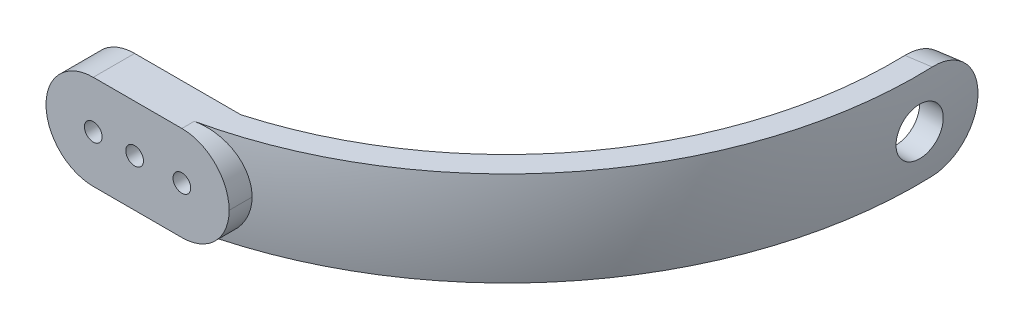
ISO-10303-21;
HEADER;
FILE_DESCRIPTION(('STEP AP214'),'2;1');
FILE_NAME('part.step','',(''),(''),'','','');
FILE_SCHEMA(('AUTOMOTIVE_DESIGN { 1 0 10303 214 1 1 1 1 }'));
ENDSEC;
DATA;
#1=APPLICATION_CONTEXT('core data for automotive mechanical design processes');
#2=APPLICATION_PROTOCOL_DEFINITION('international standard','automotive_design',2000,#1);
#3=PRODUCT_CONTEXT('',#1,'mechanical');
#4=PRODUCT('Part','Part','',(#3));
#5=PRODUCT_RELATED_PRODUCT_CATEGORY('part','',(#4));
#6=PRODUCT_DEFINITION_FORMATION('','',#4);
#7=PRODUCT_DEFINITION_CONTEXT('part definition',#1,'design');
#8=PRODUCT_DEFINITION('design','',#6,#7);
#9=PRODUCT_DEFINITION_SHAPE('','',#8);
#10=(LENGTH_UNIT() NAMED_UNIT(*) SI_UNIT(.MILLI.,.METRE.));
#11=(NAMED_UNIT(*) PLANE_ANGLE_UNIT() SI_UNIT($,.RADIAN.));
#12=(NAMED_UNIT(*) SI_UNIT($,.STERADIAN.) SOLID_ANGLE_UNIT());
#13=UNCERTAINTY_MEASURE_WITH_UNIT(LENGTH_MEASURE(1.E-05),#10,'distance_accuracy_value','');
#14=(GEOMETRIC_REPRESENTATION_CONTEXT(3) GLOBAL_UNCERTAINTY_ASSIGNED_CONTEXT((#13)) GLOBAL_UNIT_ASSIGNED_CONTEXT((#10,
#11,#12)) REPRESENTATION_CONTEXT('',''));
#15=CARTESIAN_POINT('',(0.,0.,0.));
#16=DIRECTION('',(0.,0.,1.));
#17=DIRECTION('',(1.,0.,0.));
#18=AXIS2_PLACEMENT_3D('',#15,#16,#17);
#19=CARTESIAN_POINT('',(18.,-11.,70.));
#20=DIRECTION('',(-1.,0.,0.));
#21=DIRECTION('',(0.,0.,1.));
#22=AXIS2_PLACEMENT_3D('',#19,#20,#21);
#23=PLANE('',#22);
#24=DIRECTION('',(0.,-1.,0.));
#25=VECTOR('',#24,1.);
#26=CARTESIAN_POINT('',(18.,-11.,63.));
#27=LINE('',#26,#25);
#28=CARTESIAN_POINT('',(18.,8.,63.));
#29=VERTEX_POINT('',#28);
#30=CARTESIAN_POINT('',(18.,7.93725393319381,63.));
#31=VERTEX_POINT('',#30);
#32=EDGE_CURVE('E156',#29,#31,#27,.T.);
#33=ORIENTED_EDGE('',*,*,#32,.F.);
#34=DIRECTION('',(0.,0.,-1.));
#35=VECTOR('',#34,1.);
#36=CARTESIAN_POINT('',(18.,8.,64.7628050569257));
#37=LINE('',#36,#35);
#38=CARTESIAN_POINT('',(18.,8.,62.9920629920945));
#39=VERTEX_POINT('',#38);
#40=EDGE_CURVE('E269',#29,#39,#37,.T.);
#41=ORIENTED_EDGE('',*,*,#40,.T.);
#42=CARTESIAN_POINT('',(18.,0.,0.));
#43=DIRECTION('',(-1.,0.,0.));
#44=DIRECTION('',(0.,0.,1.));
#45=AXIS2_PLACEMENT_3D('',#42,#43,#44);
#46=CIRCLE('',#45,63.4980314655502);
#47=EDGE_CURVE('E428',#39,#31,#46,.F.);
#48=ORIENTED_EDGE('',*,*,#47,.T.);
#49=EDGE_LOOP('',(#33,#41,#48));
#50=FACE_BOUND('',#49,.T.);
#51=ADVANCED_FACE('F38',(#50),#23,.T.);
#52=CARTESIAN_POINT('',(0.,0.,0.));
#53=DIRECTION('',(0.,1.,0.));
#54=DIRECTION('',(-0.15093609829513,0.,0.988543521667834));
#55=AXIS2_PLACEMENT_3D('',#52,#53,#54);
#56=SPHERICAL_SURFACE('',#55,70.);
#57=CARTESIAN_POINT('',(69.8856208386246,0.,0.));
#58=DIRECTION('',(-1.,0.,0.));
#59=DIRECTION('',(0.,0.,1.));
#60=AXIS2_PLACEMENT_3D('',#57,#58,#59);
#61=CIRCLE('',#60,4.);
#62=CARTESIAN_POINT('',(69.8856208386246,0.,4.));
#63=VERTEX_POINT('',#62);
#64=EDGE_CURVE('E260',#63,#63,#61,.F.);
#65=ORIENTED_EDGE('',*,*,#64,.F.);
#66=EDGE_LOOP('',(#65));
#67=FACE_BOUND('',#66,.T.);
#68=CARTESIAN_POINT('',(0.,-8.,0.));
#69=DIRECTION('',(0.,1.,0.));
#70=DIRECTION('',(0.,0.,1.));
#71=AXIS2_PLACEMENT_3D('',#68,#69,#70);
#72=CIRCLE('',#71,69.5413546028548);
#73=CARTESIAN_POINT('',(15.,-8.,67.9043444854598));
#74=VERTEX_POINT('',#73);
#75=CARTESIAN_POINT('',(69.4957432674389,-8.,-2.51826680600461));
#76=VERTEX_POINT('',#75);
#77=EDGE_CURVE('E262',#74,#76,#72,.T.);
#78=ORIENTED_EDGE('',*,*,#77,.T.);
#79=CARTESIAN_POINT('',(69.4957432674389,-8.,-2.51826680600461));
#80=CARTESIAN_POINT('',(69.4875017131773,-8.00002341088787,-2.74571022100777));
#81=CARTESIAN_POINT('',(69.4792451961191,-7.99041729842394,-2.97315022801403));
#82=CARTESIAN_POINT('',(69.4627618438289,-7.95211387095649,-3.42641067374961));
#83=CARTESIAN_POINT('',(69.454535007599,-7.92341720391869,-3.65223116718501));
#84=CARTESIAN_POINT('',(69.4381746620994,-7.84712196636212,-4.10052930067805));
#85=CARTESIAN_POINT('',(69.43004110291,-7.79953404317318,-4.32300875060695));
#86=CARTESIAN_POINT('',(69.4139221562662,-7.68578819540183,-4.76317095642592));
#87=CARTESIAN_POINT('',(69.4059367665958,-7.61963054877588,-4.98085378406049));
#88=CARTESIAN_POINT('',(69.3901687417773,-7.46915353972273,-5.40999269046236));
#89=CARTESIAN_POINT('',(69.3823862211648,-7.38482415662114,-5.62144526017022));
#90=CARTESIAN_POINT('',(69.3670867983283,-7.19860403533245,-6.03648590257849));
#91=CARTESIAN_POINT('',(69.3595699007931,-7.09671298732663,-6.2400738364553));
#92=CARTESIAN_POINT('',(69.3448607511406,-6.87610069542728,-6.63786836378274));
#93=CARTESIAN_POINT('',(69.3376684242268,-6.75738335548599,-6.83207711936929));
#94=CARTESIAN_POINT('',(69.3236620342563,-6.50392732566858,-7.209755898544));
#95=CARTESIAN_POINT('',(69.3168479680533,-6.36918876907945,-7.39322601145231));
#96=CARTESIAN_POINT('',(69.3036715056989,-6.08506983708116,-7.747547544861));
#97=CARTESIAN_POINT('',(69.2973077882913,-5.9357356385859,-7.9184359433393));
#98=CARTESIAN_POINT('',(69.2850591763619,-5.623127954664,-8.24696658545992));
#99=CARTESIAN_POINT('',(69.279174279028,-5.45985455110906,-8.40460890689207));
#100=CARTESIAN_POINT('',(69.2679289700822,-5.12048516489429,-8.7055223848724));
#101=CARTESIAN_POINT('',(69.2625686649089,-4.94438659262226,-8.84879062509506));
#102=CARTESIAN_POINT('',(69.2524171642138,-4.58065066029969,-9.11985890931045));
#103=CARTESIAN_POINT('',(69.2476259568048,-4.39301354138502,-9.24765927638969));
#104=CARTESIAN_POINT('',(69.2386785777475,-4.00870050323243,-9.48612462730155));
#105=CARTESIAN_POINT('',(69.2345187553523,-3.81208582632338,-9.59688817423157));
#106=CARTESIAN_POINT('',(69.2268336563934,-3.41018259287138,-9.80137791333396));
#107=CARTESIAN_POINT('',(69.2233083648441,-3.20489424131619,-9.89510450786889));
#108=CARTESIAN_POINT('',(69.2169227719366,-2.78720866014903,-10.0647829076265));
#109=CARTESIAN_POINT('',(69.2140621148858,-2.57481530287342,-10.1407442204416));
#110=CARTESIAN_POINT('',(69.2090276733347,-2.14443038685262,-10.2743711011757));
#111=CARTESIAN_POINT('',(69.2068537117056,-1.92644028746473,-10.3320413871665));
#112=CARTESIAN_POINT('',(69.2027123119848,-1.42621101601336,-10.4418725915661));
#113=CARTESIAN_POINT('',(69.2009629066603,-1.14266384447631,-10.4882412030183));
#114=CARTESIAN_POINT('',(69.1992133951032,-0.715176496997681,-10.5346070220113));
#115=CARTESIAN_POINT('',(69.1987759911827,-0.572394442625608,-10.5461977675899));
#116=CARTESIAN_POINT('',(69.1981925736217,-0.286419278335483,-10.5616569569071));
#117=CARTESIAN_POINT('',(69.1980465456946,-0.143226188915702,-10.56552577926));
#118=CARTESIAN_POINT('',(69.1980465167484,0.,-10.5655268806588));
#119=B_SPLINE_CURVE_WITH_KNOTS('',3,(#79,#80,#81,#82,#83,#84,#85,#86,#87,#88,#89,#90,#91,#92,
#93,#94,#95,#96,#97,#98,#99,#100,#101,#102,#103,#104,#105,#106,#107,#108,#109,#110,#111,#112,
#113,#114,#115,#116,#117,#118),.UNSPECIFIED.,.F.,.F.,(4,2,2,2,2,2,2,2,2,2,2,2,2,2,2,2,2,2,2,4),
(0.,0.682571489050463,1.36511981165193,2.04728398707933,2.72943795223981,3.41196905340096,
4.09451219684575,4.77689723848464,5.45927660348346,6.13956297691261,6.81984535496558,
7.5002654760771,8.18067138240227,8.85697951641801,9.53327167595491,10.2092010661415,
10.8849559619135,11.7450117926331,12.1745930697614,12.6041532835312),.UNSPECIFIED.);
#120=CARTESIAN_POINT('',(69.1980465167484,0.,-10.5655268806588));
#121=VERTEX_POINT('',#120);
#122=EDGE_CURVE('E180',#76,#121,#119,.T.);
#123=ORIENTED_EDGE('',*,*,#122,.T.);
#124=CARTESIAN_POINT('',(69.1980465167484,0.,-10.5655268806588));
#125=CARTESIAN_POINT('',(69.1980454665854,0.223947349429619,-10.5655519530303));
#126=CARTESIAN_POINT('',(69.1984034306223,0.447890695833986,-10.5560698861715));
#127=CARTESIAN_POINT('',(69.1998297882943,0.894167069433206,-10.5182728785933));
#128=CARTESIAN_POINT('',(69.2008981387781,1.11650019360936,-10.4899590817786));
#129=CARTESIAN_POINT('',(69.2037363433769,1.55777479057265,-10.4147152080081));
#130=CARTESIAN_POINT('',(69.2055055399614,1.77671924310613,-10.3678025803559));
#131=CARTESIAN_POINT('',(69.2097306228365,2.20987282548712,-10.2557151044174));
#132=CARTESIAN_POINT('',(69.2121865024183,2.42408200157534,-10.1905404345477));
#133=CARTESIAN_POINT('',(69.2177661925202,2.84633701563722,-10.0423753283899));
#134=CARTESIAN_POINT('',(69.2208902765638,3.05438028982769,-9.95937759633485));
#135=CARTESIAN_POINT('',(69.2277805149374,3.46274753133228,-9.77618930816188));
#136=CARTESIAN_POINT('',(69.2315466817563,3.66307134840357,-9.67599841762239));
#137=CARTESIAN_POINT('',(69.2396902095121,4.05456147171132,-9.45917070776137));
#138=CARTESIAN_POINT('',(69.2440674858784,4.24572904016114,-9.34253616403391));
#139=CARTESIAN_POINT('',(69.2533987341467,4.61760089386994,-9.09365739958339));
#140=CARTESIAN_POINT('',(69.2583527044525,4.79830520808605,-8.96141322206315));
#141=CARTESIAN_POINT('',(69.2688121658212,5.14846210115382,-8.68189750614859));
#142=CARTESIAN_POINT('',(69.2743190868676,5.31788351851896,-8.53458698548188));
#143=CARTESIAN_POINT('',(69.2858320949033,5.64382591204606,-8.22624327010059));
#144=CARTESIAN_POINT('',(69.2918383433573,5.80034268246081,-8.06520563609497));
#145=CARTESIAN_POINT('',(69.3043020954338,6.0993416497677,-7.73059660131886));
#146=CARTESIAN_POINT('',(69.3107596148327,6.24182335557913,-7.55702476235007));
#147=CARTESIAN_POINT('',(69.3240762701585,6.51177178276996,-7.1985873971491));
#148=CARTESIAN_POINT('',(69.330935409192,6.63923838798169,-7.01372178355692));
#149=CARTESIAN_POINT('',(69.3450490423056,6.87906426497763,-6.63277343977008));
#150=CARTESIAN_POINT('',(69.3523058101003,6.9913202980599,-6.4366257900794));
#151=CARTESIAN_POINT('',(69.3671161500053,7.19893989695086,-6.03568300426128));
#152=CARTESIAN_POINT('',(69.3746696221904,7.29430909137596,-5.83089077778256));
#153=CARTESIAN_POINT('',(69.3900180757666,7.46753509014453,-5.41408163024053));
#154=CARTESIAN_POINT('',(69.3978130039499,7.54539572191819,-5.20206629986378));
#155=CARTESIAN_POINT('',(69.4135852747677,7.68308590386594,-4.77235374693561));
#156=CARTESIAN_POINT('',(69.421562576273,7.74291947721329,-4.55465780395194));
#157=CARTESIAN_POINT('',(69.4404981442556,7.86212536279592,-4.0370243506344));
#158=CARTESIAN_POINT('',(69.4515114652535,7.913827880283,-3.73526822285095));
#159=CARTESIAN_POINT('',(69.4680844138113,7.9655258306655,-3.28009406649817));
#160=CARTESIAN_POINT('',(69.4736148382899,7.9784491663695,-3.12802106580806));
#161=CARTESIAN_POINT('',(69.484679679444,7.99568495680472,-2.82340092784478));
#162=CARTESIAN_POINT('',(69.4902140957397,7.9999981440219,-2.67085383200995));
#163=CARTESIAN_POINT('',(69.4957432674389,8.,-2.51826680600461));
#164=B_SPLINE_CURVE_WITH_KNOTS('',3,(#124,#125,#126,#127,#128,#129,#130,#131,#132,#133,#134,
#135,#136,#137,#138,#139,#140,#141,#142,#143,#144,#145,#146,#147,#148,#149,#150,#151,#152,#153,
#154,#155,#156,#157,#158,#159,#160,#161,#162,#163),.UNSPECIFIED.,.F.,.F.,(4,2,2,2,2,2,2,2,2,2,2,
2,2,2,2,2,2,2,2,4),(0.,0.671635368372018,1.34322994300633,2.01419591735426,2.68515533671865,
3.35638993475575,4.02763759035662,4.69879244476894,5.3699454416675,6.04288113790545,
6.71603529042563,7.38921298795271,8.06239589332727,8.73994065468902,9.41725915416632,
10.0944294453107,10.7714484974216,11.6882651247465,12.1462254015622,12.6041467169396),.UNSPECIFIED.);
#165=CARTESIAN_POINT('',(69.4957432674389,8.,-2.51826680600461));
#166=VERTEX_POINT('',#165);
#167=EDGE_CURVE('E171',#121,#166,#164,.T.);
#168=ORIENTED_EDGE('',*,*,#167,.T.);
#169=CARTESIAN_POINT('',(0.,8.,0.));
#170=DIRECTION('',(0.,1.,0.));
#171=DIRECTION('',(0.,0.,1.));
#172=AXIS2_PLACEMENT_3D('',#169,#170,#171);
#173=CIRCLE('',#172,69.5413546028548);
#174=CARTESIAN_POINT('',(15.,8.,67.9043444854598));
#175=VERTEX_POINT('',#174);
#176=EDGE_CURVE('E149',#175,#166,#173,.T.);
#177=ORIENTED_EDGE('',*,*,#176,.F.);
#178=CARTESIAN_POINT('',(15.,8.,67.9043444854598));
#179=CARTESIAN_POINT('',(15.2292062725426,8.00002124707828,67.8537136287984));
#180=CARTESIAN_POINT('',(15.4583983663156,7.99015045861157,67.8030281497459));
#181=CARTESIAN_POINT('',(15.9151453167856,7.95078357147516,67.7019067386223));
#182=CARTESIAN_POINT('',(16.1427001821122,7.92128757632186,67.6514708052363));
#183=CARTESIAN_POINT('',(16.594548929824,7.84283204057458,67.5512105782443));
#184=CARTESIAN_POINT('',(16.818843060833,7.79387399207213,67.5013862380514));
#185=CARTESIAN_POINT('',(17.2625900554091,7.67680484623127,67.4027056681577));
#186=CARTESIAN_POINT('',(17.4820430147384,7.60869412811482,67.3538494193093));
#187=CARTESIAN_POINT('',(17.9146895937432,7.45368540438562,67.2574281301334));
#188=CARTESIAN_POINT('',(18.1278786421793,7.36677404725622,67.2098640346053));
#189=CARTESIAN_POINT('',(18.5462792597172,7.17473950190849,67.1164197891441));
#190=CARTESIAN_POINT('',(18.7514907588961,7.06961615410688,67.0705396539712));
#191=CARTESIAN_POINT('',(19.1523403762765,6.8418702292022,66.9808315881375));
#192=CARTESIAN_POINT('',(19.3479817243004,6.71925361137289,66.9370029653319));
#193=CARTESIAN_POINT('',(19.7282793814668,6.45729693647524,66.8517272538304));
#194=CARTESIAN_POINT('',(19.9129358678915,6.31795714940773,66.8102801267005));
#195=CARTESIAN_POINT('',(20.2679141946846,6.02506914781207,66.7305338457381));
#196=CARTESIAN_POINT('',(20.4383687500698,5.87168970485998,66.6922056503031));
#197=CARTESIAN_POINT('',(20.7657989998587,5.55050907784231,66.6185213562539));
#198=CARTESIAN_POINT('',(20.9227750010497,5.38270822219861,66.5831651899932));
#199=CARTESIAN_POINT('',(21.222027814741,5.0338058092508,66.5157147116921));
#200=CARTESIAN_POINT('',(21.3643018455104,4.85270174592253,66.4836210169561));
#201=CARTESIAN_POINT('',(21.6329491795917,4.47850748925774,66.4229812964602));
#202=CARTESIAN_POINT('',(21.7593230840022,4.28541774944782,66.3944351365875));
#203=CARTESIAN_POINT('',(21.9924020654914,3.89321805110493,66.3417562031847));
#204=CARTESIAN_POINT('',(22.0994927960646,3.69434883359788,66.3175369953309));
#205=CARTESIAN_POINT('',(22.2966137934148,3.28792264955067,66.2729362847887));
#206=CARTESIAN_POINT('',(22.3866448145402,3.08036606764508,66.2525546124121));
#207=CARTESIAN_POINT('',(22.5488395035726,2.65821461273919,66.2158225230867));
#208=CARTESIAN_POINT('',(22.6210166971893,2.44362520811223,66.1994690544897));
#209=CARTESIAN_POINT('',(22.7469607662079,2.00893233517514,66.1709254912831));
#210=CARTESIAN_POINT('',(22.8007333539046,1.78883060054666,66.1587341048781));
#211=CARTESIAN_POINT('',(22.896558030183,1.30896644037356,66.1370047541603));
#212=CARTESIAN_POINT('',(22.9353473081042,1.04850458278868,66.1282059185894));
#213=CARTESIAN_POINT('',(22.9741342443534,0.656096847579059,66.1194069835085));
#214=CARTESIAN_POINT('',(22.9838303821287,0.525082467293003,66.1172072276797));
#215=CARTESIAN_POINT('',(22.99676305295,0.262720466776172,66.1142731160627));
#216=CARTESIAN_POINT('',(22.9999996630867,0.13137285054111,66.113538742786));
#217=CARTESIAN_POINT('',(23.,0.,66.1135387042624));
#218=B_SPLINE_CURVE_WITH_KNOTS('',3,(#178,#179,#180,#181,#182,#183,#184,#185,#186,#187,#188,
#189,#190,#191,#192,#193,#194,#195,#196,#197,#198,#199,#200,#201,#202,#203,#204,#205,#206,#207,
#208,#209,#210,#211,#212,#213,#214,#215,#216,#217),.UNSPECIFIED.,.F.,.F.,(4,2,2,2,2,2,2,2,2,2,2,
2,2,2,2,2,2,2,2,4),(0.,0.703985274037146,1.40796683481688,2.11189443405478,2.81580809654017,
3.52022330320237,4.22464468264261,4.92882666370941,5.63299727706607,6.329600981835,
7.0261888269025,7.72290823159178,8.41960128913236,9.10026425828163,9.78089712277246,
10.4610127629842,11.140917121762,11.9298634210277,12.323894453178,12.7179207827646),.UNSPECIFIED.);
#219=CARTESIAN_POINT('',(23.,0.,66.1135387042624));
#220=VERTEX_POINT('',#219);
#221=EDGE_CURVE('E11',#175,#220,#218,.T.);
#222=ORIENTED_EDGE('',*,*,#221,.T.);
#223=CARTESIAN_POINT('',(23.,0.,66.1135387042624));
#224=CARTESIAN_POINT('',(23.0000269880451,-0.220997502160253,66.1135321687056));
#225=CARTESIAN_POINT('',(22.9908436865702,-0.441989427328227,66.115616098668));
#226=CARTESIAN_POINT('',(22.9542526915268,-0.882360041920494,66.1239173905684));
#227=CARTESIAN_POINT('',(22.9268468008237,-1.10173888876523,66.1301343436027));
#228=CARTESIAN_POINT('',(22.8540596641734,-1.5370091390269,66.146642197528));
#229=CARTESIAN_POINT('',(22.8087045959354,-1.75290514680633,66.1569271654716));
#230=CARTESIAN_POINT('',(22.7003969576648,-2.18000331896746,66.1814796059804));
#231=CARTESIAN_POINT('',(22.6374444295899,-2.39120549453938,66.1957470690502));
#232=CARTESIAN_POINT('',(22.4944443976811,-2.80744245655006,66.22814303528));
#233=CARTESIAN_POINT('',(22.4143962874495,-3.0124770239231,66.2462716753998));
#234=CARTESIAN_POINT('',(22.2378100873343,-3.41503014116871,66.2862436463877));
#235=CARTESIAN_POINT('',(22.1412659367087,-3.6125458958545,66.3080883425434));
#236=CARTESIAN_POINT('',(21.932481894317,-3.99860526479969,66.3553019734689));
#237=CARTESIAN_POINT('',(21.8202451006609,-4.18715064020682,66.3806702125988));
#238=CARTESIAN_POINT('',(21.5809152272439,-4.55406791706324,66.4347294228986));
#239=CARTESIAN_POINT('',(21.4538215519938,-4.73243941029928,66.4634205272541));
#240=CARTESIAN_POINT('',(21.1842731025688,-5.0797249350459,66.5242267217534));
#241=CARTESIAN_POINT('',(21.0416663807282,-5.24851509922291,66.5563756382404));
#242=CARTESIAN_POINT('',(20.743310490832,-5.57342188714034,66.6235830181166));
#243=CARTESIAN_POINT('',(20.5875612312153,-5.72953842257145,66.6586415017761));
#244=CARTESIAN_POINT('',(20.2640217982758,-6.02814611802573,66.7314069213324));
#245=CARTESIAN_POINT('',(20.0962291067364,-6.17063441384435,66.7691144110867));
#246=CARTESIAN_POINT('',(19.7498280389245,-6.44107279352472,66.8468897623267));
#247=CARTESIAN_POINT('',(19.5712196143426,-6.56902281244259,66.8869576343552));
#248=CARTESIAN_POINT('',(19.2000829396511,-6.81246732572781,66.9701372380574));
#249=CARTESIAN_POINT('',(19.0073252489304,-6.92759521963085,67.013298574792));
#250=CARTESIAN_POINT('',(18.6132218883865,-7.14106716627811,67.1014551690303));
#251=CARTESIAN_POINT('',(18.4118789972992,-7.23941659886311,67.1464498329424));
#252=CARTESIAN_POINT('',(18.0019461247658,-7.41878408554253,67.2379632984776));
#253=CARTESIAN_POINT('',(17.79335631164,-7.49980254186154,67.2844820646998));
#254=CARTESIAN_POINT('',(17.370449846268,-7.64401157313948,67.3786963863018));
#255=CARTESIAN_POINT('',(17.1561342338867,-7.70720536147218,67.4263917278843));
#256=CARTESIAN_POINT('',(16.6223666230116,-7.84057898270197,67.5450513228949));
#257=CARTESIAN_POINT('',(16.3003384533434,-7.90035873007411,67.6165289972181));
#258=CARTESIAN_POINT('',(15.81422983832,-7.96013277617987,67.7242526674005));
#259=CARTESIAN_POINT('',(15.6517675455273,-7.97507484933947,67.7602263131144));
#260=CARTESIAN_POINT('',(15.3262219978427,-7.99500769407888,67.8322536678935));
#261=CARTESIAN_POINT('',(15.1631386417788,-7.99999676816249,67.8683073895662));
#262=CARTESIAN_POINT('',(15.,-8.,67.9043444854598));
#263=B_SPLINE_CURVE_WITH_KNOTS('',3,(#223,#224,#225,#226,#227,#228,#229,#230,#231,#232,#233,
#234,#235,#236,#237,#238,#239,#240,#241,#242,#243,#244,#245,#246,#247,#248,#249,#250,#251,#252,
#253,#254,#255,#256,#257,#258,#259,#260,#261,#262),.UNSPECIFIED.,.F.,.F.,(4,2,2,2,2,2,2,2,2,2,2,
2,2,2,2,2,2,2,2,4),(0.,0.662783709410763,1.32550185557689,1.98725701139818,2.64901058940825,
3.31078764439036,3.97280836502285,4.63469857070388,5.29661531517797,5.9657265437878,
6.63484243433628,7.30409864328793,7.97335784175278,8.65846172337293,9.34334551893059,
10.0282134176922,10.7129577716465,11.7159034743776,12.2168574573207,12.7178968712783),.UNSPECIFIED.);
#264=EDGE_CURVE('E48',#220,#74,#263,.T.);
#265=ORIENTED_EDGE('',*,*,#264,.T.);
#266=EDGE_LOOP('',(#78,#123,#168,#177,#222,#265));
#267=FACE_BOUND('',#266,.T.);
#268=ADVANCED_FACE('F190',(#67,#267),#56,.T.);
#269=CARTESIAN_POINT('',(0.,0.,0.));
#270=DIRECTION('',(0.,1.,0.));
#271=DIRECTION('',(-0.15093609829513,0.,0.988543521667834));
#272=AXIS2_PLACEMENT_3D('',#269,#270,#271);
#273=SPHERICAL_SURFACE('',#272,66.);
#274=CARTESIAN_POINT('',(65.8786763680024,0.,0.));
#275=DIRECTION('',(-1.,0.,0.));
#276=DIRECTION('',(0.,0.,1.));
#277=AXIS2_PLACEMENT_3D('',#274,#275,#276);
#278=CIRCLE('',#277,4.);
#279=CARTESIAN_POINT('',(65.8786763680024,0.,4.));
#280=VERTEX_POINT('',#279);
#281=EDGE_CURVE('E257',#280,#280,#278,.T.);
#282=ORIENTED_EDGE('',*,*,#281,.F.);
#283=EDGE_LOOP('',(#282));
#284=FACE_BOUND('',#283,.T.);
#285=CARTESIAN_POINT('',(65.4856261894513,8.,-1.90598073848083));
#286=CARTESIAN_POINT('',(65.4789954262735,8.00002331039559,-2.13380636503772));
#287=CARTESIAN_POINT('',(65.4723466680325,7.99040586848371,-2.36162869269555));
#288=CARTESIAN_POINT('',(65.4590615649028,7.95205630562121,-2.81565226137605));
#289=CARTESIAN_POINT('',(65.4524252196232,7.92332479719066,-3.04185355411084));
#290=CARTESIAN_POINT('',(65.4392164665826,7.84693444830008,-3.49091461906332));
#291=CARTESIAN_POINT('',(65.4326440263639,7.79928579247756,-3.7137761224706));
#292=CARTESIAN_POINT('',(65.4196082515972,7.68539154829748,-4.15469523181643));
#293=CARTESIAN_POINT('',(65.4131449153759,7.61914624544451,-4.37275291145015));
#294=CARTESIAN_POINT('',(65.4003723194107,7.46846441023645,-4.80263336844799));
#295=CARTESIAN_POINT('',(65.3940631484835,7.38401765464265,-5.01445256552379));
#296=CARTESIAN_POINT('',(65.3816509779747,7.19753197333295,-5.43021139144909));
#297=CARTESIAN_POINT('',(65.3755479819381,7.09549274531806,-5.63415088482454));
#298=CARTESIAN_POINT('',(65.3635973701703,6.87455245634856,-6.03262714797209));
#299=CARTESIAN_POINT('',(65.3577496940183,6.75565541335526,-6.22716614352601));
#300=CARTESIAN_POINT('',(65.3463546734433,6.50180679345797,-6.60547962172241));
#301=CARTESIAN_POINT('',(65.3408073264033,6.36685535647738,-6.78925419816224));
#302=CARTESIAN_POINT('',(65.330076416556,6.08233584219563,-7.14407924927708));
#303=CARTESIAN_POINT('',(65.3248916570049,5.93282016731223,-7.31517170627174));
#304=CARTESIAN_POINT('',(65.3149071359619,5.61982791940912,-7.64408273801211));
#305=CARTESIAN_POINT('',(65.3101073719165,5.45635143899957,-7.80190140079684));
#306=CARTESIAN_POINT('',(65.3009316167273,5.11655454974036,-8.10313406933744));
#307=CARTESIAN_POINT('',(65.2965557115089,4.94023154926554,-8.24654515458513));
#308=CARTESIAN_POINT('',(65.2882656149024,4.57602698024451,-8.51785947995783));
#309=CARTESIAN_POINT('',(65.2843514135424,4.38814566146544,-8.64576305501192));
#310=CARTESIAN_POINT('',(65.2770429270389,4.0034810620114,-8.88429430877204));
#311=CARTESIAN_POINT('',(65.2736452821293,3.80676713315994,-8.9950337267011));
#312=CARTESIAN_POINT('',(65.2673671119725,3.40466521217768,-9.19945243433636));
#313=CARTESIAN_POINT('',(65.2644865740594,3.19927743265472,-9.29313214190055));
#314=CARTESIAN_POINT('',(65.2592686408014,2.78139642315216,-9.46269001732263));
#315=CARTESIAN_POINT('',(65.2569309497075,2.56890713468047,-9.53857787859031));
#316=CARTESIAN_POINT('',(65.2528175009855,2.13833429253244,-9.67202954219864));
#317=CARTESIAN_POINT('',(65.2510415972016,1.920252209877,-9.7295981105481));
#318=CARTESIAN_POINT('',(65.2476678217308,1.42093834111764,-9.83891970300549));
#319=CARTESIAN_POINT('',(65.2462448406436,1.13842816357404,-9.88499151160208));
#320=CARTESIAN_POINT('',(65.2448216968505,0.712518044561867,-9.9310605436528));
#321=CARTESIAN_POINT('',(65.2444658706974,0.570265376442719,-9.94257709645125));
#322=CARTESIAN_POINT('',(65.2439912519057,0.285352698509662,-9.95793735613073));
#323=CARTESIAN_POINT('',(65.2438724480644,0.142692708266845,-9.9617814256485));
#324=CARTESIAN_POINT('',(65.2438724300771,0.,-9.96178248747833));
#325=B_SPLINE_CURVE_WITH_KNOTS('',3,(#285,#286,#287,#288,#289,#290,#291,#292,#293,#294,#295,
#296,#297,#298,#299,#300,#301,#302,#303,#304,#305,#306,#307,#308,#309,#310,#311,#312,#313,#314,
#315,#316,#317,#318,#319,#320,#321,#322,#323,#324),.UNSPECIFIED.,.F.,.F.,(4,2,2,2,2,2,2,2,2,2,2,
2,2,2,2,2,2,2,2,4),(0.,0.68355968715997,1.36709747035441,2.05026774758158,2.7334275370268,
3.4169720425044,4.10052829479083,4.7839218984777,5.4673095464277,6.14832330234017,
6.82933254104259,7.51047954731539,8.19161183964679,8.86810465473374,9.54458089767794,
10.2206877197505,10.8966184995181,11.7534745712575,12.1814558336121,12.6094168671308),.UNSPECIFIED.);
#326=CARTESIAN_POINT('',(65.4856261894512,8.,-1.90598073848083));
#327=VERTEX_POINT('',#326);
#328=CARTESIAN_POINT('',(65.2438724300771,0.,-9.96178248747833));
#329=VERTEX_POINT('',#328);
#330=EDGE_CURVE('E294',#327,#329,#325,.T.);
#331=ORIENTED_EDGE('',*,*,#330,.T.);
#332=CARTESIAN_POINT('',(65.2438724300771,0.,-9.96178248747833));
#333=CARTESIAN_POINT('',(65.2438715281821,-0.223815813935492,-9.96180767475398));
#334=CARTESIAN_POINT('',(65.2441646200338,-0.447627560646143,-9.95232678670516));
#335=CARTESIAN_POINT('',(65.2453322640976,-0.893640690685673,-9.91453513295925));
#336=CARTESIAN_POINT('',(65.2462067800849,-1.11584217346776,-9.88622554035565));
#337=CARTESIAN_POINT('',(65.2485296336511,-1.55684949221986,-9.81099476004609));
#338=CARTESIAN_POINT('',(65.2499774207248,-1.77565837719574,-9.76409142763106));
#339=CARTESIAN_POINT('',(65.253434103878,-2.20854276854099,-9.65202872262629));
#340=CARTESIAN_POINT('',(65.2554429946425,-2.42261831972601,-9.58686952296478));
#341=CARTESIAN_POINT('',(65.2600057421423,-2.84460767363624,-9.43874403823713));
#342=CARTESIAN_POINT('',(65.2625598174613,-3.05251896670285,-9.35577061074615));
#343=CARTESIAN_POINT('',(65.2681908379462,-3.4606281390898,-9.17264130519558));
#344=CARTESIAN_POINT('',(65.2712677934979,-3.6608258651041,-9.07248508584597));
#345=CARTESIAN_POINT('',(65.2779182536187,-4.0520736893096,-8.85573855454025));
#346=CARTESIAN_POINT('',(65.2814916921115,-4.24312500024299,-8.73915042945479));
#347=CARTESIAN_POINT('',(65.2891057170139,-4.61477685309646,-8.49037849568758));
#348=CARTESIAN_POINT('',(65.2931463022765,-4.79537742067364,-8.35819472529635));
#349=CARTESIAN_POINT('',(65.3016742417094,-5.14540354353712,-8.07876732231393));
#350=CARTESIAN_POINT('',(65.3061628996878,-5.31479395225281,-7.93147970429566));
#351=CARTESIAN_POINT('',(65.3155417434446,-5.64068705350649,-7.62318879318531));
#352=CARTESIAN_POINT('',(65.320432059081,-5.79718554500619,-7.46218106367408));
#353=CARTESIAN_POINT('',(65.3305738296018,-6.09616512663733,-7.12763970755624));
#354=CARTESIAN_POINT('',(65.33582529713,-6.23864572558021,-6.95410564239452));
#355=CARTESIAN_POINT('',(65.3466476715699,-6.50861389975808,-6.5957515834977));
#356=CARTESIAN_POINT('',(65.3522185812293,-6.63610134600025,-6.41093149268464));
#357=CARTESIAN_POINT('',(65.3636777943065,-6.8760862765547,-6.02993756857893));
#358=CARTESIAN_POINT('',(65.3695681026782,-6.98846861944511,-5.83369125732057));
#359=CARTESIAN_POINT('',(65.3815808986342,-7.19634670784248,-5.43254364953888));
#360=CARTESIAN_POINT('',(65.387703308335,-7.29184805805133,-5.2276452537135));
#361=CARTESIAN_POINT('',(65.4001344745942,-7.46534787542046,-4.81061436910647));
#362=CARTESIAN_POINT('',(65.4064431919309,-7.54334999723002,-4.5984834015015));
#363=CARTESIAN_POINT('',(65.4191982107735,-7.68133407609447,-4.16853128012713));
#364=CARTESIAN_POINT('',(65.4256444815396,-7.74132001506257,-3.95071139530002));
#365=CARTESIAN_POINT('',(65.4409672059143,-7.86116336458124,-3.43163143664058));
#366=CARTESIAN_POINT('',(65.4498844438318,-7.91322690154687,-3.12851737334895));
#367=CARTESIAN_POINT('',(65.463287886478,-7.96528555998269,-2.67128048811482));
#368=CARTESIAN_POINT('',(65.4677581104079,-7.97829899497681,-2.5185157259701));
#369=CARTESIAN_POINT('',(65.4766965844778,-7.99565488126796,-2.21250765463607));
#370=CARTESIAN_POINT('',(65.4811648347559,-7.99999808827435,-2.05926438832008));
#371=CARTESIAN_POINT('',(65.4856261894512,-8.,-1.90598073848084));
#372=B_SPLINE_CURVE_WITH_KNOTS('',3,(#332,#333,#334,#335,#336,#337,#338,#339,#340,#341,#342,
#343,#344,#345,#346,#347,#348,#349,#350,#351,#352,#353,#354,#355,#356,#357,#358,#359,#360,#361,
#362,#363,#364,#365,#366,#367,#368,#369,#370,#371),.UNSPECIFIED.,.F.,.F.,(4,2,2,2,2,2,2,2,2,2,2,
2,2,2,2,2,2,2,2,4),(0.,0.671240685404946,1.34243955410822,2.01299543582438,2.68354496593199,
3.35436384947467,4.02519605857631,4.69593907288628,5.36668044041831,6.03943382022608,
6.71240556738391,7.38540088715677,8.0584019965863,8.73627289620709,9.41391830969143,
10.0914220674098,10.7687759737513,11.6895613996959,12.1495054817856,12.6094094727469),.UNSPECIFIED.);
#373=CARTESIAN_POINT('',(65.4856261894512,-8.00000000000001,-1.90598073848084));
#374=VERTEX_POINT('',#373);
#375=EDGE_CURVE('E327',#329,#374,#372,.T.);
#376=ORIENTED_EDGE('',*,*,#375,.T.);
#377=CARTESIAN_POINT('',(0.,-8.00000000000001,0.));
#378=DIRECTION('',(0.,1.,0.));
#379=DIRECTION('',(0.,0.,1.));
#380=AXIS2_PLACEMENT_3D('',#377,#378,#379);
#381=CIRCLE('',#380,65.5133574166368);
#382=CARTESIAN_POINT('',(18.,-8.00000000000001,62.9920629920945));
#383=VERTEX_POINT('',#382);
#384=EDGE_CURVE('E267',#383,#374,#381,.T.);
#385=ORIENTED_EDGE('',*,*,#384,.F.);
#386=CARTESIAN_POINT('',(18.,-7.93725393319381,63.));
#387=VERTEX_POINT('',#386);
#388=EDGE_CURVE('E147',#387,#383,#46,.F.);
#389=ORIENTED_EDGE('',*,*,#388,.F.);
#390=CARTESIAN_POINT('',(0.,0.,63.));
#391=DIRECTION('',(0.,0.,-1.));
#392=DIRECTION('',(-1.,0.,0.));
#393=AXIS2_PLACEMENT_3D('',#390,#391,#392);
#394=CIRCLE('',#393,19.672315572906);
#395=EDGE_CURVE('E154',#387,#31,#394,.F.);
#396=ORIENTED_EDGE('',*,*,#395,.T.);
#397=ORIENTED_EDGE('',*,*,#47,.F.);
#398=CARTESIAN_POINT('',(0.,8.,0.));
#399=DIRECTION('',(0.,1.,0.));
#400=DIRECTION('',(0.,0.,1.));
#401=AXIS2_PLACEMENT_3D('',#398,#399,#400);
#402=CIRCLE('',#401,65.5133574166368);
#403=EDGE_CURVE('E275',#39,#327,#402,.T.);
#404=ORIENTED_EDGE('',*,*,#403,.T.);
#405=EDGE_LOOP('',(#331,#376,#385,#389,#396,#397,#404));
#406=FACE_BOUND('',#405,.T.);
#407=ADVANCED_FACE('F195',(#284,#406),#273,.F.);
#408=CARTESIAN_POINT('',(-9.88833055468145,8.,64.7628050569257));
#409=DIRECTION('',(0.,-1.,0.));
#410=DIRECTION('',(0.,0.,-1.));
#411=AXIS2_PLACEMENT_3D('',#408,#409,#410);
#412=PLANE('',#411);
#413=ORIENTED_EDGE('',*,*,#176,.T.);
#414=DIRECTION('',(-0.988543521667834,0.,0.150936098295126));
#415=VECTOR('',#414,1.);
#416=CARTESIAN_POINT('',(-18.1186262485237,8.,10.8591625124492));
#417=LINE('',#416,#415);
#418=EDGE_CURVE('E285',#166,#327,#417,.T.);
#419=ORIENTED_EDGE('',*,*,#418,.T.);
#420=ORIENTED_EDGE('',*,*,#403,.F.);
#421=ORIENTED_EDGE('',*,*,#40,.F.);
#422=DIRECTION('',(-1.,0.,0.));
#423=VECTOR('',#422,1.);
#424=CARTESIAN_POINT('',(-8.,8.,63.));
#425=LINE('',#424,#423);
#426=CARTESIAN_POINT('',(0.,8.,63.));
#427=VERTEX_POINT('',#426);
#428=EDGE_CURVE('E140',#29,#427,#425,.T.);
#429=ORIENTED_EDGE('',*,*,#428,.T.);
#430=DIRECTION('',(0.,0.,1.));
#431=VECTOR('',#430,1.);
#432=CARTESIAN_POINT('',(0.,8.,70.));
#433=LINE('',#432,#431);
#434=CARTESIAN_POINT('',(0.,8.,70.));
#435=VERTEX_POINT('',#434);
#436=EDGE_CURVE('E302',#427,#435,#433,.T.);
#437=ORIENTED_EDGE('',*,*,#436,.T.);
#438=DIRECTION('',(-1.,0.,0.));
#439=VECTOR('',#438,1.);
#440=CARTESIAN_POINT('',(-8.,8.,70.));
#441=LINE('',#440,#439);
#442=CARTESIAN_POINT('',(15.,8.00000000000001,70.));
#443=VERTEX_POINT('',#442);
#444=EDGE_CURVE('E141',#443,#435,#441,.T.);
#445=ORIENTED_EDGE('',*,*,#444,.F.);
#446=DIRECTION('',(0.,0.,1.));
#447=VECTOR('',#446,1.);
#448=CARTESIAN_POINT('',(15.,8.,65.6277380381192));
#449=LINE('',#448,#447);
#450=EDGE_CURVE('E288',#443,#175,#449,.F.);
#451=ORIENTED_EDGE('',*,*,#450,.T.);
#452=EDGE_LOOP('',(#413,#419,#420,#421,#429,#437,#445,#451));
#453=FACE_BOUND('',#452,.T.);
#454=ADVANCED_FACE('F253',(#453),#412,.F.);
#455=CARTESIAN_POINT('',(-10.496300733913,-8.,68.7446555806577));
#456=DIRECTION('',(0.,1.,0.));
#457=DIRECTION('',(0.,0.,1.));
#458=AXIS2_PLACEMENT_3D('',#455,#456,#457);
#459=PLANE('',#458);
#460=ORIENTED_EDGE('',*,*,#384,.T.);
#461=DIRECTION('',(0.988543521667834,0.,-0.150936098295126));
#462=VECTOR('',#461,1.);
#463=CARTESIAN_POINT('',(-19.3068654115081,-8.,11.0405892065412));
#464=LINE('',#463,#462);
#465=EDGE_CURVE('E167',#374,#76,#464,.T.);
#466=ORIENTED_EDGE('',*,*,#465,.T.);
#467=ORIENTED_EDGE('',*,*,#77,.F.);
#468=DIRECTION('',(0.,0.,1.));
#469=VECTOR('',#468,1.);
#470=CARTESIAN_POINT('',(15.,-8.,70.));
#471=LINE('',#470,#469);
#472=CARTESIAN_POINT('',(15.,-7.99999999999999,70.));
#473=VERTEX_POINT('',#472);
#474=EDGE_CURVE('E163',#74,#473,#471,.T.);
#475=ORIENTED_EDGE('',*,*,#474,.T.);
#476=DIRECTION('',(1.,0.,0.));
#477=VECTOR('',#476,1.);
#478=CARTESIAN_POINT('',(-8.,-8.,70.));
#479=LINE('',#478,#477);
#480=CARTESIAN_POINT('',(0.,-8.,70.));
#481=VERTEX_POINT('',#480);
#482=EDGE_CURVE('E413',#481,#473,#479,.T.);
#483=ORIENTED_EDGE('',*,*,#482,.F.);
#484=DIRECTION('',(0.,0.,1.));
#485=VECTOR('',#484,1.);
#486=CARTESIAN_POINT('',(0.,-8.,63.));
#487=LINE('',#486,#485);
#488=CARTESIAN_POINT('',(0.,-8.,63.));
#489=VERTEX_POINT('',#488);
#490=EDGE_CURVE('E137',#481,#489,#487,.F.);
#491=ORIENTED_EDGE('',*,*,#490,.T.);
#492=DIRECTION('',(1.,0.,0.));
#493=VECTOR('',#492,1.);
#494=CARTESIAN_POINT('',(-8.,-8.,63.));
#495=LINE('',#494,#493);
#496=CARTESIAN_POINT('',(18.,-7.99999999999999,63.));
#497=VERTEX_POINT('',#496);
#498=EDGE_CURVE('E129',#489,#497,#495,.T.);
#499=ORIENTED_EDGE('',*,*,#498,.T.);
#500=DIRECTION('',(0.,0.,1.));
#501=VECTOR('',#500,1.);
#502=CARTESIAN_POINT('',(18.,-8.,68.7446555806577));
#503=LINE('',#502,#501);
#504=EDGE_CURVE('E133',#383,#497,#503,.T.);
#505=ORIENTED_EDGE('',*,*,#504,.F.);
#506=EDGE_LOOP('',(#460,#466,#467,#475,#483,#491,#499,#505));
#507=FACE_BOUND('',#506,.T.);
#508=ADVANCED_FACE('F132',(#507),#459,.F.);
#509=CARTESIAN_POINT('',(70.,0.,0.));
#510=DIRECTION('',(-1.,0.,0.));
#511=DIRECTION('',(0.,0.,1.));
#512=AXIS2_PLACEMENT_3D('',#509,#510,#511);
#513=CYLINDRICAL_SURFACE('',#512,4.);
#514=ORIENTED_EDGE('',*,*,#281,.T.);
#515=EDGE_LOOP('',(#514));
#516=FACE_BOUND('',#515,.T.);
#517=ORIENTED_EDGE('',*,*,#64,.T.);
#518=EDGE_LOOP('',(#517));
#519=FACE_BOUND('',#518,.T.);
#520=ADVANCED_FACE('F197',(#516,#519),#513,.F.);
#521=EDGE_CURVE('E145',#387,#497,#27,.T.);
#522=ORIENTED_EDGE('',*,*,#521,.F.);
#523=ORIENTED_EDGE('',*,*,#388,.T.);
#524=ORIENTED_EDGE('',*,*,#504,.T.);
#525=EDGE_LOOP('',(#522,#523,#524));
#526=FACE_BOUND('',#525,.T.);
#527=ADVANCED_FACE('F144',(#526),#23,.T.);
#528=CARTESIAN_POINT('',(0.,0.,63.));
#529=DIRECTION('',(0.,0.,-1.));
#530=DIRECTION('',(-1.,0.,0.));
#531=AXIS2_PLACEMENT_3D('',#528,#529,#530);
#532=PLANE('',#531);
#533=CARTESIAN_POINT('',(15.,0.,63.));
#534=DIRECTION('',(0.,0.,1.));
#535=DIRECTION('',(1.,0.,0.));
#536=AXIS2_PLACEMENT_3D('',#533,#534,#535);
#537=CIRCLE('',#536,1.5);
#538=CARTESIAN_POINT('',(16.5,0.,63.));
#539=VERTEX_POINT('',#538);
#540=EDGE_CURVE('E443',#539,#539,#537,.T.);
#541=ORIENTED_EDGE('',*,*,#540,.T.);
#542=EDGE_LOOP('',(#541));
#543=FACE_BOUND('',#542,.T.);
#544=CARTESIAN_POINT('',(7.,0.,63.));
#545=DIRECTION('',(0.,0.,1.));
#546=DIRECTION('',(1.,0.,0.));
#547=AXIS2_PLACEMENT_3D('',#544,#545,#546);
#548=CIRCLE('',#547,1.5);
#549=CARTESIAN_POINT('',(8.5,0.,63.));
#550=VERTEX_POINT('',#549);
#551=EDGE_CURVE('E437',#550,#550,#548,.T.);
#552=ORIENTED_EDGE('',*,*,#551,.T.);
#553=EDGE_LOOP('',(#552));
#554=FACE_BOUND('',#553,.T.);
#555=CARTESIAN_POINT('',(0.,0.,63.));
#556=DIRECTION('',(0.,0.,1.));
#557=DIRECTION('',(1.,0.,0.));
#558=AXIS2_PLACEMENT_3D('',#555,#556,#557);
#559=CIRCLE('',#558,1.5);
#560=CARTESIAN_POINT('',(1.5,0.,63.));
#561=VERTEX_POINT('',#560);
#562=EDGE_CURVE('E418',#561,#561,#559,.T.);
#563=ORIENTED_EDGE('',*,*,#562,.T.);
#564=EDGE_LOOP('',(#563));
#565=FACE_BOUND('',#564,.T.);
#566=ORIENTED_EDGE('',*,*,#498,.F.);
#567=CARTESIAN_POINT('',(0.,0.,63.));
#568=DIRECTION('',(0.,0.,-1.));
#569=DIRECTION('',(-1.,0.,0.));
#570=AXIS2_PLACEMENT_3D('',#567,#568,#569);
#571=CIRCLE('',#570,8.);
#572=CARTESIAN_POINT('',(-8.,0.,63.));
#573=VERTEX_POINT('',#572);
#574=EDGE_CURVE('E62',#489,#573,#571,.T.);
#575=ORIENTED_EDGE('',*,*,#574,.T.);
#576=CARTESIAN_POINT('',(0.,0.,63.));
#577=DIRECTION('',(0.,0.,-1.));
#578=DIRECTION('',(-1.,0.,0.));
#579=AXIS2_PLACEMENT_3D('',#576,#577,#578);
#580=CIRCLE('',#579,8.);
#581=EDGE_CURVE('E313',#573,#427,#580,.T.);
#582=ORIENTED_EDGE('',*,*,#581,.T.);
#583=ORIENTED_EDGE('',*,*,#428,.F.);
#584=ORIENTED_EDGE('',*,*,#32,.T.);
#585=ORIENTED_EDGE('',*,*,#395,.F.);
#586=ORIENTED_EDGE('',*,*,#521,.T.);
#587=EDGE_LOOP('',(#566,#575,#582,#583,#584,#585,#586));
#588=FACE_BOUND('',#587,.T.);
#589=ADVANCED_FACE('F152',(#543,#554,#565,#588),#532,.T.);
#590=CARTESIAN_POINT('',(0.,0.,70.));
#591=DIRECTION('',(0.,0.,-1.));
#592=DIRECTION('',(-1.,0.,0.));
#593=AXIS2_PLACEMENT_3D('',#590,#591,#592);
#594=PLANE('',#593);
#595=CARTESIAN_POINT('',(15.,0.,70.));
#596=DIRECTION('',(0.,0.,1.));
#597=DIRECTION('',(1.,0.,0.));
#598=AXIS2_PLACEMENT_3D('',#595,#596,#597);
#599=CIRCLE('',#598,1.5);
#600=CARTESIAN_POINT('',(16.5,0.,70.));
#601=VERTEX_POINT('',#600);
#602=EDGE_CURVE('E447',#601,#601,#599,.T.);
#603=ORIENTED_EDGE('',*,*,#602,.F.);
#604=EDGE_LOOP('',(#603));
#605=FACE_BOUND('',#604,.T.);
#606=CARTESIAN_POINT('',(7.,0.,70.));
#607=DIRECTION('',(0.,0.,1.));
#608=DIRECTION('',(1.,0.,0.));
#609=AXIS2_PLACEMENT_3D('',#606,#607,#608);
#610=CIRCLE('',#609,1.5);
#611=CARTESIAN_POINT('',(8.5,0.,70.));
#612=VERTEX_POINT('',#611);
#613=EDGE_CURVE('E439',#612,#612,#610,.T.);
#614=ORIENTED_EDGE('',*,*,#613,.F.);
#615=EDGE_LOOP('',(#614));
#616=FACE_BOUND('',#615,.T.);
#617=CARTESIAN_POINT('',(0.,0.,70.));
#618=DIRECTION('',(0.,0.,1.));
#619=DIRECTION('',(1.,0.,0.));
#620=AXIS2_PLACEMENT_3D('',#617,#618,#619);
#621=CIRCLE('',#620,1.5);
#622=CARTESIAN_POINT('',(1.5,0.,70.));
#623=VERTEX_POINT('',#622);
#624=EDGE_CURVE('E424',#623,#623,#621,.T.);
#625=ORIENTED_EDGE('',*,*,#624,.F.);
#626=EDGE_LOOP('',(#625));
#627=FACE_BOUND('',#626,.T.);
#628=ORIENTED_EDGE('',*,*,#482,.T.);
#629=CARTESIAN_POINT('',(15.,0.,70.));
#630=DIRECTION('',(0.,0.,-1.));
#631=DIRECTION('',(-1.,0.,0.));
#632=AXIS2_PLACEMENT_3D('',#629,#630,#631);
#633=CIRCLE('',#632,8.);
#634=CARTESIAN_POINT('',(23.,0.,70.));
#635=VERTEX_POINT('',#634);
#636=EDGE_CURVE('E311',#473,#635,#633,.F.);
#637=ORIENTED_EDGE('',*,*,#636,.T.);
#638=CARTESIAN_POINT('',(15.,0.,70.));
#639=DIRECTION('',(0.,0.,-1.));
#640=DIRECTION('',(-1.,0.,0.));
#641=AXIS2_PLACEMENT_3D('',#638,#639,#640);
#642=CIRCLE('',#641,8.);
#643=EDGE_CURVE('E308',#635,#443,#642,.F.);
#644=ORIENTED_EDGE('',*,*,#643,.T.);
#645=ORIENTED_EDGE('',*,*,#444,.T.);
#646=CARTESIAN_POINT('',(0.,0.,70.));
#647=DIRECTION('',(0.,0.,-1.));
#648=DIRECTION('',(-1.,0.,0.));
#649=AXIS2_PLACEMENT_3D('',#646,#647,#648);
#650=CIRCLE('',#649,8.);
#651=CARTESIAN_POINT('',(-8.,0.,70.));
#652=VERTEX_POINT('',#651);
#653=EDGE_CURVE('E296',#435,#652,#650,.F.);
#654=ORIENTED_EDGE('',*,*,#653,.T.);
#655=CARTESIAN_POINT('',(0.,0.,70.));
#656=DIRECTION('',(0.,0.,-1.));
#657=DIRECTION('',(-1.,0.,0.));
#658=AXIS2_PLACEMENT_3D('',#655,#656,#657);
#659=CIRCLE('',#658,8.);
#660=EDGE_CURVE('E300',#652,#481,#659,.F.);
#661=ORIENTED_EDGE('',*,*,#660,.T.);
#662=EDGE_LOOP('',(#628,#637,#644,#645,#654,#661));
#663=FACE_BOUND('',#662,.T.);
#664=ADVANCED_FACE('F245',(#605,#616,#627,#663),#594,.F.);
#665=CARTESIAN_POINT('',(0.,0.,63.));
#666=DIRECTION('',(0.,0.,1.));
#667=DIRECTION('',(1.,0.,0.));
#668=AXIS2_PLACEMENT_3D('',#665,#666,#667);
#669=CYLINDRICAL_SURFACE('',#668,1.5);
#670=ORIENTED_EDGE('',*,*,#562,.F.);
#671=EDGE_LOOP('',(#670));
#672=FACE_BOUND('',#671,.T.);
#673=ORIENTED_EDGE('',*,*,#624,.T.);
#674=EDGE_LOOP('',(#673));
#675=FACE_BOUND('',#674,.T.);
#676=ADVANCED_FACE('F361',(#672,#675),#669,.F.);
#677=CARTESIAN_POINT('',(7.,0.,63.));
#678=DIRECTION('',(0.,0.,1.));
#679=DIRECTION('',(1.,0.,0.));
#680=AXIS2_PLACEMENT_3D('',#677,#678,#679);
#681=CYLINDRICAL_SURFACE('',#680,1.5);
#682=ORIENTED_EDGE('',*,*,#551,.F.);
#683=EDGE_LOOP('',(#682));
#684=FACE_BOUND('',#683,.T.);
#685=ORIENTED_EDGE('',*,*,#613,.T.);
#686=EDGE_LOOP('',(#685));
#687=FACE_BOUND('',#686,.T.);
#688=ADVANCED_FACE('F457',(#684,#687),#681,.F.);
#689=CARTESIAN_POINT('',(15.,0.,63.));
#690=DIRECTION('',(0.,0.,1.));
#691=DIRECTION('',(1.,0.,0.));
#692=AXIS2_PLACEMENT_3D('',#689,#690,#691);
#693=CYLINDRICAL_SURFACE('',#692,1.5);
#694=ORIENTED_EDGE('',*,*,#540,.F.);
#695=EDGE_LOOP('',(#694));
#696=FACE_BOUND('',#695,.T.);
#697=ORIENTED_EDGE('',*,*,#602,.T.);
#698=EDGE_LOOP('',(#697));
#699=FACE_BOUND('',#698,.T.);
#700=ADVANCED_FACE('F370',(#696,#699),#693,.F.);
#701=CARTESIAN_POINT('',(-18.1186262485237,0.,10.8591625124492));
#702=DIRECTION('',(-0.988543521667834,0.,0.150936098295126));
#703=DIRECTION('',(0.150936098295126,0.,0.988543521667834));
#704=AXIS2_PLACEMENT_3D('',#701,#702,#703);
#705=CYLINDRICAL_SURFACE('',#704,8.);
#706=DIRECTION('',(-0.988543521667834,0.,0.150936098295126));
#707=VECTOR('',#706,1.);
#708=CARTESIAN_POINT('',(0.,0.,0.));
#709=LINE('',#708,#707);
#710=EDGE_CURVE('E407',#329,#121,#709,.F.);
#711=ORIENTED_EDGE('',*,*,#710,.F.);
#712=ORIENTED_EDGE('',*,*,#330,.F.);
#713=ORIENTED_EDGE('',*,*,#418,.F.);
#714=ORIENTED_EDGE('',*,*,#167,.F.);
#715=EDGE_LOOP('',(#711,#712,#713,#714));
#716=FACE_BOUND('',#715,.T.);
#717=ADVANCED_FACE('F187',(#716),#705,.T.);
#718=CARTESIAN_POINT('',(-19.3068654115081,0.,11.0405892065412));
#719=DIRECTION('',(0.988543521667834,0.,-0.150936098295126));
#720=DIRECTION('',(-0.150936098295126,0.,-0.988543521667834));
#721=AXIS2_PLACEMENT_3D('',#718,#719,#720);
#722=CYLINDRICAL_SURFACE('',#721,8.);
#723=ORIENTED_EDGE('',*,*,#375,.F.);
#724=ORIENTED_EDGE('',*,*,#710,.T.);
#725=ORIENTED_EDGE('',*,*,#122,.F.);
#726=ORIENTED_EDGE('',*,*,#465,.F.);
#727=EDGE_LOOP('',(#723,#724,#725,#726));
#728=FACE_BOUND('',#727,.T.);
#729=ADVANCED_FACE('F224',(#728),#722,.T.);
#730=CARTESIAN_POINT('',(15.,0.,63.));
#731=DIRECTION('',(0.,0.,-1.));
#732=DIRECTION('',(-1.,0.,0.));
#733=AXIS2_PLACEMENT_3D('',#730,#731,#732);
#734=CYLINDRICAL_SURFACE('',#733,8.);
#735=DIRECTION('',(0.,0.,1.));
#736=VECTOR('',#735,1.);
#737=CARTESIAN_POINT('',(23.,0.,70.));
#738=LINE('',#737,#736);
#739=EDGE_CURVE('E528',#220,#635,#738,.T.);
#740=ORIENTED_EDGE('',*,*,#739,.F.);
#741=ORIENTED_EDGE('',*,*,#221,.F.);
#742=ORIENTED_EDGE('',*,*,#450,.F.);
#743=ORIENTED_EDGE('',*,*,#643,.F.);
#744=EDGE_LOOP('',(#740,#741,#742,#743));
#745=FACE_BOUND('',#744,.T.);
#746=ADVANCED_FACE('F220',(#745),#734,.T.);
#747=CARTESIAN_POINT('',(15.,0.,68.7446555806577));
#748=DIRECTION('',(0.,0.,-1.));
#749=DIRECTION('',(-1.,0.,0.));
#750=AXIS2_PLACEMENT_3D('',#747,#748,#749);
#751=CYLINDRICAL_SURFACE('',#750,8.);
#752=ORIENTED_EDGE('',*,*,#264,.F.);
#753=ORIENTED_EDGE('',*,*,#739,.T.);
#754=ORIENTED_EDGE('',*,*,#636,.F.);
#755=ORIENTED_EDGE('',*,*,#474,.F.);
#756=EDGE_LOOP('',(#752,#753,#754,#755));
#757=FACE_BOUND('',#756,.T.);
#758=ADVANCED_FACE('F217',(#757),#751,.T.);
#759=CARTESIAN_POINT('',(0.,0.,64.7628050569257));
#760=DIRECTION('',(0.,0.,-1.));
#761=DIRECTION('',(-1.,0.,0.));
#762=AXIS2_PLACEMENT_3D('',#759,#760,#761);
#763=CYLINDRICAL_SURFACE('',#762,8.);
#764=ORIENTED_EDGE('',*,*,#436,.F.);
#765=ORIENTED_EDGE('',*,*,#581,.F.);
#766=DIRECTION('',(0.,0.,1.));
#767=VECTOR('',#766,1.);
#768=CARTESIAN_POINT('',(-8.,0.,63.));
#769=LINE('',#768,#767);
#770=EDGE_CURVE('E42',#652,#573,#769,.F.);
#771=ORIENTED_EDGE('',*,*,#770,.F.);
#772=ORIENTED_EDGE('',*,*,#653,.F.);
#773=EDGE_LOOP('',(#764,#765,#771,#772));
#774=FACE_BOUND('',#773,.T.);
#775=ADVANCED_FACE('F40',(#774),#763,.T.);
#776=CARTESIAN_POINT('',(0.,0.,63.));
#777=DIRECTION('',(0.,0.,-1.));
#778=DIRECTION('',(-1.,0.,0.));
#779=AXIS2_PLACEMENT_3D('',#776,#777,#778);
#780=CYLINDRICAL_SURFACE('',#779,8.);
#781=ORIENTED_EDGE('',*,*,#574,.F.);
#782=ORIENTED_EDGE('',*,*,#490,.F.);
#783=ORIENTED_EDGE('',*,*,#660,.F.);
#784=ORIENTED_EDGE('',*,*,#770,.T.);
#785=EDGE_LOOP('',(#781,#782,#783,#784));
#786=FACE_BOUND('',#785,.T.);
#787=ADVANCED_FACE('F226',(#786),#780,.T.);
#788=CLOSED_SHELL('',(#51,#268,#407,#454,#508,#520,#527,#589,#664,#676,#688,#700,#717,#729,#746,
#758,#775,#787));
#789=MANIFOLD_SOLID_BREP('B2',#788);
#790=ADVANCED_BREP_SHAPE_REPRESENTATION('',(#18,#789),#14);
#791=SHAPE_DEFINITION_REPRESENTATION(#9,#790);
ENDSEC;
END-ISO-10303-21;
